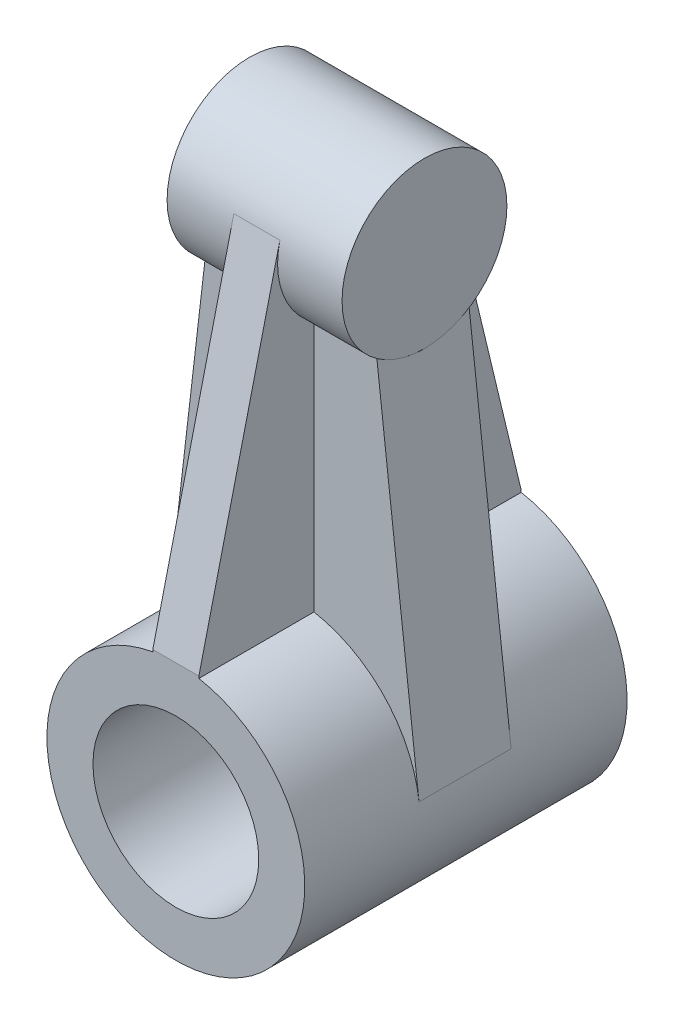
ISO-10303-21;
HEADER;
FILE_DESCRIPTION(('STEP AP214'),'2;1');
FILE_NAME('part.step','',(''),(''),'','','');
FILE_SCHEMA(('AUTOMOTIVE_DESIGN { 1 0 10303 214 1 1 1 1 }'));
ENDSEC;
DATA;
#1=APPLICATION_CONTEXT('core data for automotive mechanical design processes');
#2=APPLICATION_PROTOCOL_DEFINITION('international standard','automotive_design',2000,#1);
#3=PRODUCT_CONTEXT('',#1,'mechanical');
#4=PRODUCT('Part','Part','',(#3));
#5=PRODUCT_RELATED_PRODUCT_CATEGORY('part','',(#4));
#6=PRODUCT_DEFINITION_FORMATION('','',#4);
#7=PRODUCT_DEFINITION_CONTEXT('part definition',#1,'design');
#8=PRODUCT_DEFINITION('design','',#6,#7);
#9=PRODUCT_DEFINITION_SHAPE('','',#8);
#10=(LENGTH_UNIT() NAMED_UNIT(*) SI_UNIT(.MILLI.,.METRE.));
#11=(NAMED_UNIT(*) PLANE_ANGLE_UNIT() SI_UNIT($,.RADIAN.));
#12=(NAMED_UNIT(*) SI_UNIT($,.STERADIAN.) SOLID_ANGLE_UNIT());
#13=UNCERTAINTY_MEASURE_WITH_UNIT(LENGTH_MEASURE(1.E-05),#10,'distance_accuracy_value','');
#14=(GEOMETRIC_REPRESENTATION_CONTEXT(3) GLOBAL_UNCERTAINTY_ASSIGNED_CONTEXT((#13)) GLOBAL_UNIT_ASSIGNED_CONTEXT((#10,
#11,#12)) REPRESENTATION_CONTEXT('',''));
#15=CARTESIAN_POINT('',(0.,0.,0.));
#16=DIRECTION('',(0.,0.,1.));
#17=DIRECTION('',(1.,0.,0.));
#18=AXIS2_PLACEMENT_3D('',#15,#16,#17);
#19=CARTESIAN_POINT('',(-2.5,-500000.,35.));
#20=DIRECTION('',(1.,0.,0.));
#21=DIRECTION('',(0.,0.,-1.));
#22=AXIS2_PLACEMENT_3D('',#19,#20,#21);
#23=PLANE('',#22);
#24=DIRECTION('',(0.,1.,0.));
#25=VECTOR('',#24,1.);
#26=CARTESIAN_POINT('',(-2.5,-500000.,22.5));
#27=LINE('',#26,#25);
#28=CARTESIAN_POINT('',(-2.5,13.7749773139559,22.5));
#29=VERTEX_POINT('',#28);
#30=CARTESIAN_POINT('',(-2.5,41.0725707079518,22.5));
#31=VERTEX_POINT('',#30);
#32=EDGE_CURVE('E159',#29,#31,#27,.T.);
#33=ORIENTED_EDGE('',*,*,#32,.F.);
#34=DIRECTION('',(0.,0.,-1.));
#35=VECTOR('',#34,1.);
#36=CARTESIAN_POINT('',(-2.5,13.7749773139559,35.));
#37=LINE('',#36,#35);
#38=CARTESIAN_POINT('',(-2.5,13.7749773139559,35.));
#39=VERTEX_POINT('',#38);
#40=EDGE_CURVE('E247',#39,#29,#37,.T.);
#41=ORIENTED_EDGE('',*,*,#40,.F.);
#42=DIRECTION('',(0.,1.,0.));
#43=VECTOR('',#42,1.);
#44=CARTESIAN_POINT('',(-2.5,-500000.,35.));
#45=LINE('',#44,#43);
#46=CARTESIAN_POINT('',(-2.5,14.,35.));
#47=VERTEX_POINT('',#46);
#48=EDGE_CURVE('E244',#39,#47,#45,.T.);
#49=ORIENTED_EDGE('',*,*,#48,.T.);
#50=DIRECTION('',(0.,0.972289948272102,-0.233778220732886));
#51=VECTOR('',#50,1.);
#52=CARTESIAN_POINT('',(-2.5,8.72063908586975,36.2693740208931));
#53=LINE('',#52,#51);
#54=CARTESIAN_POINT('',(-2.5,50.5888183272756,26.2025534538852));
#55=VERTEX_POINT('',#54);
#56=EDGE_CURVE('E220',#47,#55,#53,.T.);
#57=ORIENTED_EDGE('',*,*,#56,.T.);
#58=CARTESIAN_POINT('',(-2.5,48.4963689854947,17.5));
#59=DIRECTION('',(1.,0.,0.));
#60=DIRECTION('',(0.,0.,-1.));
#61=AXIS2_PLACEMENT_3D('',#58,#59,#60);
#62=CIRCLE('',#61,8.95057433160846);
#63=EDGE_CURVE('E218',#55,#31,#62,.T.);
#64=ORIENTED_EDGE('',*,*,#63,.T.);
#65=EDGE_LOOP('',(#33,#41,#49,#57,#64));
#66=FACE_BOUND('',#65,.T.);
#67=ADVANCED_FACE('F35',(#66),#23,.F.);
#68=CARTESIAN_POINT('',(2.5,0.,0.));
#69=DIRECTION('',(1.,0.,0.));
#70=DIRECTION('',(0.,0.,-1.));
#71=AXIS2_PLACEMENT_3D('',#68,#69,#70);
#72=PLANE('',#71);
#73=DIRECTION('',(0.,0.,-1.));
#74=VECTOR('',#73,1.);
#75=CARTESIAN_POINT('',(2.5,13.7749773139559,35.));
#76=LINE('',#75,#74);
#77=CARTESIAN_POINT('',(2.5,13.7749773139717,22.5));
#78=VERTEX_POINT('',#77);
#79=CARTESIAN_POINT('',(2.5,13.7749773139717,35.));
#80=VERTEX_POINT('',#79);
#81=EDGE_CURVE('E201',#78,#80,#76,.F.);
#82=ORIENTED_EDGE('',*,*,#81,.F.);
#83=DIRECTION('',(0.,1.,0.));
#84=VECTOR('',#83,1.);
#85=CARTESIAN_POINT('',(2.5,0.,22.5));
#86=LINE('',#85,#84);
#87=CARTESIAN_POINT('',(2.5,41.0725707079518,22.5));
#88=VERTEX_POINT('',#87);
#89=EDGE_CURVE('E43',#78,#88,#86,.T.);
#90=ORIENTED_EDGE('',*,*,#89,.T.);
#91=CARTESIAN_POINT('',(2.5,48.4963689854947,17.5));
#92=DIRECTION('',(1.,0.,0.));
#93=DIRECTION('',(0.,0.,-1.));
#94=AXIS2_PLACEMENT_3D('',#91,#92,#93);
#95=CIRCLE('',#94,8.95057433160846);
#96=CARTESIAN_POINT('',(2.5,50.5888183272731,26.2025534538751));
#97=VERTEX_POINT('',#96);
#98=EDGE_CURVE('E207',#97,#88,#95,.T.);
#99=ORIENTED_EDGE('',*,*,#98,.F.);
#100=DIRECTION('',(0.,0.972289948272102,-0.233778220732886));
#101=VECTOR('',#100,1.);
#102=CARTESIAN_POINT('',(2.5,8.72063908586975,36.2693740208931));
#103=LINE('',#102,#101);
#104=CARTESIAN_POINT('',(2.5,14.,35.));
#105=VERTEX_POINT('',#104);
#106=EDGE_CURVE('E210',#105,#97,#103,.T.);
#107=ORIENTED_EDGE('',*,*,#106,.F.);
#108=DIRECTION('',(0.,1.,0.));
#109=VECTOR('',#108,1.);
#110=CARTESIAN_POINT('',(2.5,-500000.,35.));
#111=LINE('',#110,#109);
#112=EDGE_CURVE('E196',#80,#105,#111,.T.);
#113=ORIENTED_EDGE('',*,*,#112,.F.);
#114=EDGE_LOOP('',(#82,#90,#99,#107,#113));
#115=FACE_BOUND('',#114,.T.);
#116=ADVANCED_FACE('F263',(#115),#72,.T.);
#117=CARTESIAN_POINT('',(0.,0.,35.));
#118=DIRECTION('',(0.,0.,-1.));
#119=DIRECTION('',(-1.,0.,0.));
#120=AXIS2_PLACEMENT_3D('',#117,#118,#119);
#121=CYLINDRICAL_SURFACE('',#120,14.);
#122=CARTESIAN_POINT('',(0.,0.,12.5));
#123=DIRECTION('',(0.,0.,-1.));
#124=DIRECTION('',(-1.,0.,0.));
#125=AXIS2_PLACEMENT_3D('',#122,#123,#124);
#126=CIRCLE('',#125,14.);
#127=CARTESIAN_POINT('',(2.5,13.7749773139717,12.5));
#128=VERTEX_POINT('',#127);
#129=CARTESIAN_POINT('',(13.9064723547255,1.61555768923787,12.5));
#130=VERTEX_POINT('',#129);
#131=EDGE_CURVE('E188',#128,#130,#126,.T.);
#132=ORIENTED_EDGE('',*,*,#131,.T.);
#133=DIRECTION('',(0.,0.,-1.));
#134=VECTOR('',#133,1.);
#135=CARTESIAN_POINT('',(13.9064723547255,1.61555768923787,35.));
#136=LINE('',#135,#134);
#137=CARTESIAN_POINT('',(13.9064723547255,1.61555768923787,22.5));
#138=VERTEX_POINT('',#137);
#139=EDGE_CURVE('E194',#138,#130,#136,.T.);
#140=ORIENTED_EDGE('',*,*,#139,.F.);
#141=CARTESIAN_POINT('',(0.,0.,22.5));
#142=DIRECTION('',(0.,0.,-1.));
#143=DIRECTION('',(-1.,0.,0.));
#144=AXIS2_PLACEMENT_3D('',#141,#142,#143);
#145=CIRCLE('',#144,14.);
#146=EDGE_CURVE('E183',#78,#138,#145,.T.);
#147=ORIENTED_EDGE('',*,*,#146,.F.);
#148=ORIENTED_EDGE('',*,*,#81,.T.);
#149=CARTESIAN_POINT('',(0.,0.,35.));
#150=DIRECTION('',(0.,0.,1.));
#151=DIRECTION('',(1.,0.,0.));
#152=AXIS2_PLACEMENT_3D('',#149,#150,#151);
#153=CIRCLE('',#152,14.);
#154=EDGE_CURVE('E255',#39,#80,#153,.T.);
#155=ORIENTED_EDGE('',*,*,#154,.F.);
#156=ORIENTED_EDGE('',*,*,#40,.T.);
#157=CARTESIAN_POINT('',(0.,0.,22.5));
#158=DIRECTION('',(0.,0.,-1.));
#159=DIRECTION('',(-1.,0.,0.));
#160=AXIS2_PLACEMENT_3D('',#157,#158,#159);
#161=CIRCLE('',#160,14.);
#162=CARTESIAN_POINT('',(-13.9064723547255,1.61555768923787,22.5));
#163=VERTEX_POINT('',#162);
#164=EDGE_CURVE('E55',#163,#29,#161,.T.);
#165=ORIENTED_EDGE('',*,*,#164,.F.);
#166=DIRECTION('',(0.,0.,-1.));
#167=VECTOR('',#166,1.);
#168=CARTESIAN_POINT('',(-13.9064723547255,1.61555768923787,35.));
#169=LINE('',#168,#167);
#170=CARTESIAN_POINT('',(-13.9064723547255,1.61555768923787,12.5));
#171=VERTEX_POINT('',#170);
#172=EDGE_CURVE('E50',#171,#163,#169,.F.);
#173=ORIENTED_EDGE('',*,*,#172,.F.);
#174=CARTESIAN_POINT('',(0.,0.,12.5));
#175=DIRECTION('',(0.,0.,-1.));
#176=DIRECTION('',(-1.,0.,0.));
#177=AXIS2_PLACEMENT_3D('',#174,#175,#176);
#178=CIRCLE('',#177,14.);
#179=CARTESIAN_POINT('',(-2.5,13.7749773139559,12.5));
#180=VERTEX_POINT('',#179);
#181=EDGE_CURVE('E152',#171,#180,#178,.T.);
#182=ORIENTED_EDGE('',*,*,#181,.T.);
#183=CARTESIAN_POINT('',(-2.5,13.7749773139559,0.));
#184=VERTEX_POINT('',#183);
#185=EDGE_CURVE('E233',#180,#184,#37,.T.);
#186=ORIENTED_EDGE('',*,*,#185,.T.);
#187=CARTESIAN_POINT('',(0.,0.,0.));
#188=DIRECTION('',(0.,0.,1.));
#189=DIRECTION('',(1.,0.,0.));
#190=AXIS2_PLACEMENT_3D('',#187,#188,#189);
#191=CIRCLE('',#190,14.);
#192=CARTESIAN_POINT('',(2.5,13.7749773139717,0.));
#193=VERTEX_POINT('',#192);
#194=EDGE_CURVE('E252',#184,#193,#191,.T.);
#195=ORIENTED_EDGE('',*,*,#194,.T.);
#196=EDGE_CURVE('E197',#193,#128,#76,.F.);
#197=ORIENTED_EDGE('',*,*,#196,.T.);
#198=EDGE_LOOP('',(#132,#140,#147,#148,#155,#156,#165,#173,#182,#186,#195,#197));
#199=FACE_BOUND('',#198,.T.);
#200=ADVANCED_FACE('F37',(#199),#121,.T.);
#201=CARTESIAN_POINT('',(0.,0.,35.));
#202=DIRECTION('',(0.,0.,1.));
#203=DIRECTION('',(1.,0.,0.));
#204=AXIS2_PLACEMENT_3D('',#201,#202,#203);
#205=PLANE('',#204);
#206=ORIENTED_EDGE('',*,*,#154,.T.);
#207=ORIENTED_EDGE('',*,*,#112,.T.);
#208=DIRECTION('',(-1.,0.,0.));
#209=VECTOR('',#208,1.);
#210=CARTESIAN_POINT('',(2.5,14.,35.));
#211=LINE('',#210,#209);
#212=EDGE_CURVE('E237',#105,#47,#211,.T.);
#213=ORIENTED_EDGE('',*,*,#212,.T.);
#214=ORIENTED_EDGE('',*,*,#48,.F.);
#215=EDGE_LOOP('',(#206,#207,#213,#214));
#216=FACE_BOUND('',#215,.T.);
#217=CARTESIAN_POINT('',(0.,0.,35.));
#218=DIRECTION('',(0.,0.,1.));
#219=DIRECTION('',(1.,0.,0.));
#220=AXIS2_PLACEMENT_3D('',#217,#218,#219);
#221=CIRCLE('',#220,9.);
#222=CARTESIAN_POINT('',(9.,0.,35.));
#223=VERTEX_POINT('',#222);
#224=EDGE_CURVE('E249',#223,#223,#221,.T.);
#225=ORIENTED_EDGE('',*,*,#224,.F.);
#226=EDGE_LOOP('',(#225));
#227=FACE_BOUND('',#226,.T.);
#228=ADVANCED_FACE('F275',(#216,#227),#205,.T.);
#229=CARTESIAN_POINT('',(0.,0.,0.));
#230=DIRECTION('',(0.,0.,1.));
#231=DIRECTION('',(1.,0.,0.));
#232=AXIS2_PLACEMENT_3D('',#229,#230,#231);
#233=PLANE('',#232);
#234=ORIENTED_EDGE('',*,*,#194,.F.);
#235=DIRECTION('',(0.,1.,0.));
#236=VECTOR('',#235,1.);
#237=CARTESIAN_POINT('',(-2.5,-500000.,0.));
#238=LINE('',#237,#236);
#239=CARTESIAN_POINT('',(-2.5,14.,0.));
#240=VERTEX_POINT('',#239);
#241=EDGE_CURVE('E238',#184,#240,#238,.T.);
#242=ORIENTED_EDGE('',*,*,#241,.T.);
#243=DIRECTION('',(1.,0.,0.));
#244=VECTOR('',#243,1.);
#245=CARTESIAN_POINT('',(-2.5,14.,0.));
#246=LINE('',#245,#244);
#247=CARTESIAN_POINT('',(2.5,14.,0.));
#248=VERTEX_POINT('',#247);
#249=EDGE_CURVE('E235',#240,#248,#246,.T.);
#250=ORIENTED_EDGE('',*,*,#249,.T.);
#251=DIRECTION('',(0.,1.,0.));
#252=VECTOR('',#251,1.);
#253=CARTESIAN_POINT('',(2.5,-500000.,0.));
#254=LINE('',#253,#252);
#255=EDGE_CURVE('E202',#193,#248,#254,.T.);
#256=ORIENTED_EDGE('',*,*,#255,.F.);
#257=EDGE_LOOP('',(#234,#242,#250,#256));
#258=FACE_BOUND('',#257,.T.);
#259=CARTESIAN_POINT('',(0.,0.,0.));
#260=DIRECTION('',(0.,0.,1.));
#261=DIRECTION('',(1.,0.,0.));
#262=AXIS2_PLACEMENT_3D('',#259,#260,#261);
#263=CIRCLE('',#262,9.);
#264=CARTESIAN_POINT('',(9.,0.,0.));
#265=VERTEX_POINT('',#264);
#266=EDGE_CURVE('E241',#265,#265,#263,.T.);
#267=ORIENTED_EDGE('',*,*,#266,.T.);
#268=EDGE_LOOP('',(#267));
#269=FACE_BOUND('',#268,.T.);
#270=ADVANCED_FACE('F314',(#258,#269),#233,.F.);
#271=CARTESIAN_POINT('',(0.,0.,35.));
#272=DIRECTION('',(0.,0.,-1.));
#273=DIRECTION('',(-1.,0.,0.));
#274=AXIS2_PLACEMENT_3D('',#271,#272,#273);
#275=CYLINDRICAL_SURFACE('',#274,9.);
#276=ORIENTED_EDGE('',*,*,#266,.F.);
#277=EDGE_LOOP('',(#276));
#278=FACE_BOUND('',#277,.T.);
#279=ORIENTED_EDGE('',*,*,#224,.T.);
#280=EDGE_LOOP('',(#279));
#281=FACE_BOUND('',#280,.T.);
#282=ADVANCED_FACE('F309',(#278,#281),#275,.F.);
#283=ORIENTED_EDGE('',*,*,#185,.F.);
#284=DIRECTION('',(0.,1.,0.));
#285=VECTOR('',#284,1.);
#286=CARTESIAN_POINT('',(-2.5,-500000.,12.5));
#287=LINE('',#286,#285);
#288=CARTESIAN_POINT('',(-2.5,41.0725707079518,12.5));
#289=VERTEX_POINT('',#288);
#290=EDGE_CURVE('E171',#180,#289,#287,.T.);
#291=ORIENTED_EDGE('',*,*,#290,.T.);
#292=CARTESIAN_POINT('',(-2.5,50.5888183272707,8.79744654613499));
#293=VERTEX_POINT('',#292);
#294=EDGE_CURVE('E200',#289,#293,#62,.T.);
#295=ORIENTED_EDGE('',*,*,#294,.T.);
#296=DIRECTION('',(0.,0.972289948272102,0.233778220732886));
#297=VECTOR('',#296,1.);
#298=CARTESIAN_POINT('',(-2.5,0.765131590846478,-3.18220299800931));
#299=LINE('',#298,#297);
#300=EDGE_CURVE('E223',#240,#293,#299,.T.);
#301=ORIENTED_EDGE('',*,*,#300,.F.);
#302=ORIENTED_EDGE('',*,*,#241,.F.);
#303=EDGE_LOOP('',(#283,#291,#295,#301,#302));
#304=FACE_BOUND('',#303,.T.);
#305=ADVANCED_FACE('F297',(#304),#23,.F.);
#306=CARTESIAN_POINT('',(9.5,48.4963689854947,17.5));
#307=DIRECTION('',(-1.,0.,0.));
#308=DIRECTION('',(0.,0.,1.));
#309=AXIS2_PLACEMENT_3D('',#306,#307,#308);
#310=CYLINDRICAL_SURFACE('',#309,8.95057433160846);
#311=CARTESIAN_POINT('',(8.46018423539227,48.4963689854947,17.5));
#312=DIRECTION('',(0.993319453908964,0.115396977802705,0.));
#313=DIRECTION('',(-0.115396977802705,0.993319453908964,0.));
#314=AXIS2_PLACEMENT_3D('',#311,#312,#313);
#315=ELLIPSE('',#314,9.01077120395224,8.95057433160846);
#316=CARTESIAN_POINT('',(9.32262972729732,41.0725707079518,22.5));
#317=VERTEX_POINT('',#316);
#318=CARTESIAN_POINT('',(9.5,39.5457946538862,17.5));
#319=VERTEX_POINT('',#318);
#320=EDGE_CURVE('E192',#317,#319,#315,.T.);
#321=ORIENTED_EDGE('',*,*,#320,.T.);
#322=CARTESIAN_POINT('',(9.5,48.4963689854947,17.5));
#323=DIRECTION('',(1.,0.,0.));
#324=DIRECTION('',(0.,0.,-1.));
#325=AXIS2_PLACEMENT_3D('',#322,#323,#324);
#326=CIRCLE('',#325,8.95057433160846);
#327=EDGE_CURVE('E231',#319,#319,#326,.T.);
#328=ORIENTED_EDGE('',*,*,#327,.F.);
#329=CARTESIAN_POINT('',(9.32262972729732,41.0725707079518,12.5));
#330=VERTEX_POINT('',#329);
#331=EDGE_CURVE('E191',#319,#330,#315,.T.);
#332=ORIENTED_EDGE('',*,*,#331,.T.);
#333=DIRECTION('',(-1.,0.,0.));
#334=VECTOR('',#333,1.);
#335=CARTESIAN_POINT('',(9.5,41.0725707079518,12.5));
#336=LINE('',#335,#334);
#337=CARTESIAN_POINT('',(2.5,41.0725707079518,12.5));
#338=VERTEX_POINT('',#337);
#339=EDGE_CURVE('E185',#330,#338,#336,.T.);
#340=ORIENTED_EDGE('',*,*,#339,.T.);
#341=CARTESIAN_POINT('',(2.5,50.5888183272731,8.7974465461249));
#342=VERTEX_POINT('',#341);
#343=EDGE_CURVE('E211',#338,#342,#95,.T.);
#344=ORIENTED_EDGE('',*,*,#343,.T.);
#345=DIRECTION('',(-1.,0.,0.));
#346=VECTOR('',#345,1.);
#347=CARTESIAN_POINT('',(2.5,50.5888183272707,8.79744654613499));
#348=LINE('',#347,#346);
#349=EDGE_CURVE('E217',#342,#293,#348,.T.);
#350=ORIENTED_EDGE('',*,*,#349,.T.);
#351=ORIENTED_EDGE('',*,*,#294,.F.);
#352=DIRECTION('',(-1.,0.,0.));
#353=VECTOR('',#352,1.);
#354=CARTESIAN_POINT('',(9.5,41.0725707079518,12.5));
#355=LINE('',#354,#353);
#356=CARTESIAN_POINT('',(-9.32262972729732,41.0725707079518,12.5));
#357=VERTEX_POINT('',#356);
#358=EDGE_CURVE('E169',#289,#357,#355,.T.);
#359=ORIENTED_EDGE('',*,*,#358,.T.);
#360=CARTESIAN_POINT('',(-8.46018423539227,48.4963689854947,17.5));
#361=DIRECTION('',(0.993319453908964,-0.115396977802705,0.));
#362=DIRECTION('',(-0.115396977802705,-0.993319453908964,0.));
#363=AXIS2_PLACEMENT_3D('',#360,#361,#362);
#364=ELLIPSE('',#363,9.01077120395224,8.95057433160846);
#365=CARTESIAN_POINT('',(-9.5,39.5457946538862,17.5));
#366=VERTEX_POINT('',#365);
#367=EDGE_CURVE('E151',#357,#366,#364,.F.);
#368=ORIENTED_EDGE('',*,*,#367,.T.);
#369=CARTESIAN_POINT('',(-9.5,48.4963689854947,17.5));
#370=DIRECTION('',(1.,0.,0.));
#371=DIRECTION('',(0.,0.,-1.));
#372=AXIS2_PLACEMENT_3D('',#369,#370,#371);
#373=CIRCLE('',#372,8.95057433160846);
#374=EDGE_CURVE('E147',#366,#366,#373,.T.);
#375=ORIENTED_EDGE('',*,*,#374,.T.);
#376=CARTESIAN_POINT('',(-9.32262972729732,41.0725707079518,22.5));
#377=VERTEX_POINT('',#376);
#378=EDGE_CURVE('E140',#366,#377,#364,.F.);
#379=ORIENTED_EDGE('',*,*,#378,.T.);
#380=DIRECTION('',(-1.,0.,0.));
#381=VECTOR('',#380,1.);
#382=CARTESIAN_POINT('',(9.5,41.0725707079518,22.5));
#383=LINE('',#382,#381);
#384=EDGE_CURVE('E144',#31,#377,#383,.T.);
#385=ORIENTED_EDGE('',*,*,#384,.F.);
#386=ORIENTED_EDGE('',*,*,#63,.F.);
#387=DIRECTION('',(-1.,0.,0.));
#388=VECTOR('',#387,1.);
#389=CARTESIAN_POINT('',(2.5,50.5888183272707,26.202553453865));
#390=LINE('',#389,#388);
#391=EDGE_CURVE('E228',#97,#55,#390,.T.);
#392=ORIENTED_EDGE('',*,*,#391,.F.);
#393=ORIENTED_EDGE('',*,*,#98,.T.);
#394=DIRECTION('',(-1.,0.,0.));
#395=VECTOR('',#394,1.);
#396=CARTESIAN_POINT('',(9.5,41.0725707079518,22.5));
#397=LINE('',#396,#395);
#398=EDGE_CURVE('E179',#317,#88,#397,.T.);
#399=ORIENTED_EDGE('',*,*,#398,.F.);
#400=EDGE_LOOP('',(#321,#328,#332,#340,#344,#350,#351,#359,#368,#375,#379,#385,#386,#392,#393,#399));
#401=FACE_BOUND('',#400,.T.);
#402=ADVANCED_FACE('F143',(#401),#310,.T.);
#403=CARTESIAN_POINT('',(9.5,48.4963689854947,17.5));
#404=DIRECTION('',(1.,0.,0.));
#405=DIRECTION('',(0.,0.,-1.));
#406=AXIS2_PLACEMENT_3D('',#403,#404,#405);
#407=PLANE('',#406);
#408=ORIENTED_EDGE('',*,*,#327,.T.);
#409=EDGE_LOOP('',(#408));
#410=FACE_BOUND('',#409,.T.);
#411=ADVANCED_FACE('F287',(#410),#407,.T.);
#412=CARTESIAN_POINT('',(-9.5,48.4963689854947,17.5));
#413=DIRECTION('',(1.,0.,0.));
#414=DIRECTION('',(0.,0.,-1.));
#415=AXIS2_PLACEMENT_3D('',#412,#413,#414);
#416=PLANE('',#415);
#417=ORIENTED_EDGE('',*,*,#374,.F.);
#418=EDGE_LOOP('',(#417));
#419=FACE_BOUND('',#418,.T.);
#420=ADVANCED_FACE('F289',(#419),#416,.F.);
#421=CARTESIAN_POINT('',(2.5,8.72063908586975,36.2693740208931));
#422=DIRECTION('',(0.,0.233778220732886,0.972289948272102));
#423=DIRECTION('',(0.,-0.972289948272102,0.233778220732886));
#424=AXIS2_PLACEMENT_3D('',#421,#422,#423);
#425=PLANE('',#424);
#426=ORIENTED_EDGE('',*,*,#56,.F.);
#427=ORIENTED_EDGE('',*,*,#212,.F.);
#428=ORIENTED_EDGE('',*,*,#106,.T.);
#429=ORIENTED_EDGE('',*,*,#391,.T.);
#430=EDGE_LOOP('',(#426,#427,#428,#429));
#431=FACE_BOUND('',#430,.T.);
#432=ADVANCED_FACE('F270',(#431),#425,.T.);
#433=CARTESIAN_POINT('',(2.5,0.765131590846478,-3.18220299800931));
#434=DIRECTION('',(0.,-0.233778220732886,0.972289948272102));
#435=DIRECTION('',(0.,-0.972289948272102,-0.233778220732886));
#436=AXIS2_PLACEMENT_3D('',#433,#434,#435);
#437=PLANE('',#436);
#438=ORIENTED_EDGE('',*,*,#300,.T.);
#439=ORIENTED_EDGE('',*,*,#349,.F.);
#440=DIRECTION('',(0.,0.972289948272102,0.233778220732886));
#441=VECTOR('',#440,1.);
#442=CARTESIAN_POINT('',(2.5,0.765131590846478,-3.18220299800931));
#443=LINE('',#442,#441);
#444=EDGE_CURVE('E214',#248,#342,#443,.T.);
#445=ORIENTED_EDGE('',*,*,#444,.F.);
#446=ORIENTED_EDGE('',*,*,#249,.F.);
#447=EDGE_LOOP('',(#438,#439,#445,#446));
#448=FACE_BOUND('',#447,.T.);
#449=ADVANCED_FACE('F329',(#448),#437,.F.);
#450=DIRECTION('',(0.,1.,0.));
#451=VECTOR('',#450,1.);
#452=CARTESIAN_POINT('',(2.5,0.,12.5));
#453=LINE('',#452,#451);
#454=EDGE_CURVE('E11',#128,#338,#453,.T.);
#455=ORIENTED_EDGE('',*,*,#454,.F.);
#456=ORIENTED_EDGE('',*,*,#196,.F.);
#457=ORIENTED_EDGE('',*,*,#255,.T.);
#458=ORIENTED_EDGE('',*,*,#444,.T.);
#459=ORIENTED_EDGE('',*,*,#343,.F.);
#460=EDGE_LOOP('',(#455,#456,#457,#458,#459));
#461=FACE_BOUND('',#460,.T.);
#462=ADVANCED_FACE('F306',(#461),#72,.T.);
#463=CARTESIAN_POINT('',(9.5,39.5457946538862,17.5));
#464=DIRECTION('',(0.993319453908964,0.115396977802705,0.));
#465=DIRECTION('',(0.115396977802705,-0.993319453908964,0.));
#466=AXIS2_PLACEMENT_3D('',#463,#464,#465);
#467=PLANE('',#466);
#468=DIRECTION('',(0.115396977802705,-0.993319453908964,0.));
#469=VECTOR('',#468,1.);
#470=CARTESIAN_POINT('',(9.5,39.5457946538862,22.5));
#471=LINE('',#470,#469);
#472=EDGE_CURVE('E175',#317,#138,#471,.T.);
#473=ORIENTED_EDGE('',*,*,#472,.T.);
#474=ORIENTED_EDGE('',*,*,#139,.T.);
#475=DIRECTION('',(0.115396977802705,-0.993319453908964,0.));
#476=VECTOR('',#475,1.);
#477=CARTESIAN_POINT('',(9.5,39.5457946538862,12.5));
#478=LINE('',#477,#476);
#479=EDGE_CURVE('E176',#330,#130,#478,.T.);
#480=ORIENTED_EDGE('',*,*,#479,.F.);
#481=ORIENTED_EDGE('',*,*,#331,.F.);
#482=ORIENTED_EDGE('',*,*,#320,.F.);
#483=EDGE_LOOP('',(#473,#474,#480,#481,#482));
#484=FACE_BOUND('',#483,.T.);
#485=ADVANCED_FACE('F281',(#484),#467,.T.);
#486=CARTESIAN_POINT('',(0.,21.7234716585516,12.5));
#487=DIRECTION('',(0.,0.,-1.));
#488=DIRECTION('',(-1.,0.,0.));
#489=AXIS2_PLACEMENT_3D('',#486,#487,#488);
#490=PLANE('',#489);
#491=ORIENTED_EDGE('',*,*,#131,.F.);
#492=ORIENTED_EDGE('',*,*,#454,.T.);
#493=ORIENTED_EDGE('',*,*,#339,.F.);
#494=ORIENTED_EDGE('',*,*,#479,.T.);
#495=EDGE_LOOP('',(#491,#492,#493,#494));
#496=FACE_BOUND('',#495,.T.);
#497=ADVANCED_FACE('F337',(#496),#490,.T.);
#498=CARTESIAN_POINT('',(0.,21.7234716585516,22.5));
#499=DIRECTION('',(0.,0.,-1.));
#500=DIRECTION('',(-1.,0.,0.));
#501=AXIS2_PLACEMENT_3D('',#498,#499,#500);
#502=PLANE('',#501);
#503=ORIENTED_EDGE('',*,*,#89,.F.);
#504=ORIENTED_EDGE('',*,*,#146,.T.);
#505=ORIENTED_EDGE('',*,*,#472,.F.);
#506=ORIENTED_EDGE('',*,*,#398,.T.);
#507=EDGE_LOOP('',(#503,#504,#505,#506));
#508=FACE_BOUND('',#507,.T.);
#509=ADVANCED_FACE('F279',(#508),#502,.F.);
#510=CARTESIAN_POINT('',(-9.5,39.5457946538862,17.5));
#511=DIRECTION('',(0.993319453908964,-0.115396977802705,0.));
#512=DIRECTION('',(-0.115396977802705,-0.993319453908964,0.));
#513=AXIS2_PLACEMENT_3D('',#510,#511,#512);
#514=PLANE('',#513);
#515=DIRECTION('',(-0.115396977802705,-0.993319453908964,0.));
#516=VECTOR('',#515,1.);
#517=CARTESIAN_POINT('',(-9.5,39.5457946538862,12.5));
#518=LINE('',#517,#516);
#519=EDGE_CURVE('E160',#357,#171,#518,.T.);
#520=ORIENTED_EDGE('',*,*,#519,.T.);
#521=ORIENTED_EDGE('',*,*,#172,.T.);
#522=DIRECTION('',(-0.115396977802705,-0.993319453908964,0.));
#523=VECTOR('',#522,1.);
#524=CARTESIAN_POINT('',(-9.5,39.5457946538862,22.5));
#525=LINE('',#524,#523);
#526=EDGE_CURVE('E158',#377,#163,#525,.T.);
#527=ORIENTED_EDGE('',*,*,#526,.F.);
#528=ORIENTED_EDGE('',*,*,#378,.F.);
#529=ORIENTED_EDGE('',*,*,#367,.F.);
#530=EDGE_LOOP('',(#520,#521,#527,#528,#529));
#531=FACE_BOUND('',#530,.T.);
#532=ADVANCED_FACE('F163',(#531),#514,.F.);
#533=CARTESIAN_POINT('',(0.,21.7234716585516,12.5));
#534=DIRECTION('',(0.,0.,-1.));
#535=DIRECTION('',(-1.,0.,0.));
#536=AXIS2_PLACEMENT_3D('',#533,#534,#535);
#537=PLANE('',#536);
#538=ORIENTED_EDGE('',*,*,#181,.F.);
#539=ORIENTED_EDGE('',*,*,#519,.F.);
#540=ORIENTED_EDGE('',*,*,#358,.F.);
#541=ORIENTED_EDGE('',*,*,#290,.F.);
#542=EDGE_LOOP('',(#538,#539,#540,#541));
#543=FACE_BOUND('',#542,.T.);
#544=ADVANCED_FACE('F323',(#543),#537,.T.);
#545=CARTESIAN_POINT('',(0.,21.7234716585516,22.5));
#546=DIRECTION('',(0.,0.,-1.));
#547=DIRECTION('',(-1.,0.,0.));
#548=AXIS2_PLACEMENT_3D('',#545,#546,#547);
#549=PLANE('',#548);
#550=ORIENTED_EDGE('',*,*,#526,.T.);
#551=ORIENTED_EDGE('',*,*,#164,.T.);
#552=ORIENTED_EDGE('',*,*,#32,.T.);
#553=ORIENTED_EDGE('',*,*,#384,.T.);
#554=EDGE_LOOP('',(#550,#551,#552,#553));
#555=FACE_BOUND('',#554,.T.);
#556=ADVANCED_FACE('F157',(#555),#549,.F.);
#557=CLOSED_SHELL('',(#67,#116,#200,#228,#270,#282,#305,#402,#411,#420,#432,#449,#462,#485,#497,
#509,#532,#544,#556));
#558=MANIFOLD_SOLID_BREP('B2',#557);
#559=ADVANCED_BREP_SHAPE_REPRESENTATION('',(#18,#558),#14);
#560=SHAPE_DEFINITION_REPRESENTATION(#9,#559);
ENDSEC;
END-ISO-10303-21;
